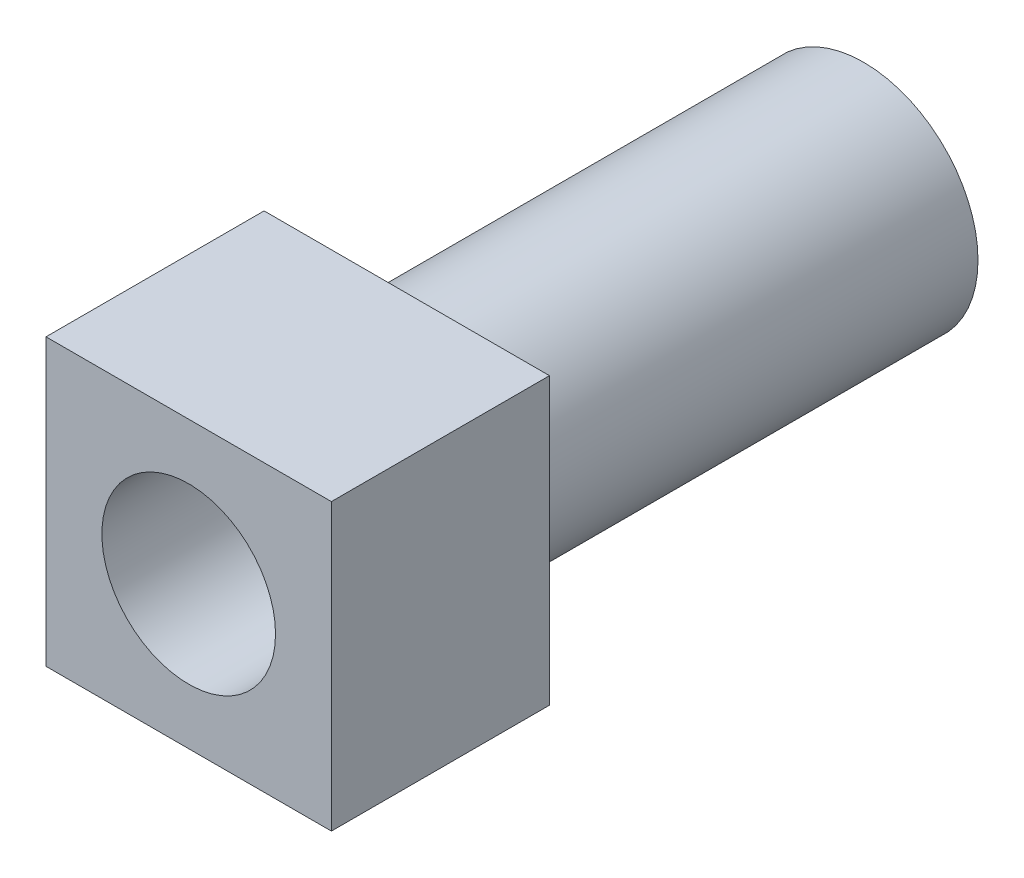
ISO-10303-21;
HEADER;
FILE_DESCRIPTION(('STEP AP214'),'2;1');
FILE_NAME('part.step','',(''),(''),'','','');
FILE_SCHEMA(('AUTOMOTIVE_DESIGN { 1 0 10303 214 1 1 1 1 }'));
ENDSEC;
DATA;
#1=APPLICATION_CONTEXT('core data for automotive mechanical design processes');
#2=APPLICATION_PROTOCOL_DEFINITION('international standard','automotive_design',2000,#1);
#3=PRODUCT_CONTEXT('',#1,'mechanical');
#4=PRODUCT('Part','Part','',(#3));
#5=PRODUCT_RELATED_PRODUCT_CATEGORY('part','',(#4));
#6=PRODUCT_DEFINITION_FORMATION('','',#4);
#7=PRODUCT_DEFINITION_CONTEXT('part definition',#1,'design');
#8=PRODUCT_DEFINITION('design','',#6,#7);
#9=PRODUCT_DEFINITION_SHAPE('','',#8);
#10=(LENGTH_UNIT() NAMED_UNIT(*) SI_UNIT(.MILLI.,.METRE.));
#11=(NAMED_UNIT(*) PLANE_ANGLE_UNIT() SI_UNIT($,.RADIAN.));
#12=(NAMED_UNIT(*) SI_UNIT($,.STERADIAN.) SOLID_ANGLE_UNIT());
#13=UNCERTAINTY_MEASURE_WITH_UNIT(LENGTH_MEASURE(1.E-05),#10,'distance_accuracy_value','');
#14=(GEOMETRIC_REPRESENTATION_CONTEXT(3) GLOBAL_UNCERTAINTY_ASSIGNED_CONTEXT((#13)) GLOBAL_UNIT_ASSIGNED_CONTEXT((#10,
#11,#12)) REPRESENTATION_CONTEXT('',''));
#15=CARTESIAN_POINT('',(0.,0.,0.));
#16=DIRECTION('',(0.,0.,1.));
#17=DIRECTION('',(1.,0.,0.));
#18=AXIS2_PLACEMENT_3D('',#15,#16,#17);
#19=CARTESIAN_POINT('',(0.,0.,0.));
#20=DIRECTION('',(0.,0.,1.));
#21=DIRECTION('',(1.,0.,0.));
#22=AXIS2_PLACEMENT_3D('',#19,#20,#21);
#23=PLANE('',#22);
#24=DIRECTION('',(0.,-1.,0.));
#25=VECTOR('',#24,1.);
#26=CARTESIAN_POINT('',(-37.0560711306256,15.4804,0.));
#27=LINE('',#26,#25);
#28=CARTESIAN_POINT('',(-37.0560711306256,15.4804,0.));
#29=VERTEX_POINT('',#28);
#30=CARTESIAN_POINT('',(-37.0560711306256,1.74039999999999,0.));
#31=VERTEX_POINT('',#30);
#32=EDGE_CURVE('E125',#29,#31,#27,.T.);
#33=ORIENTED_EDGE('',*,*,#32,.F.);
#34=DIRECTION('',(-1.,0.,0.));
#35=VECTOR('',#34,1.);
#36=CARTESIAN_POINT('',(-37.0560711306256,15.4804,0.));
#37=LINE('',#36,#35);
#38=CARTESIAN_POINT('',(-23.3160711306256,15.4804,0.));
#39=VERTEX_POINT('',#38);
#40=EDGE_CURVE('E80',#39,#29,#37,.T.);
#41=ORIENTED_EDGE('',*,*,#40,.F.);
#42=DIRECTION('',(0.,1.,0.));
#43=VECTOR('',#42,1.);
#44=CARTESIAN_POINT('',(-23.3160711306256,15.4804,0.));
#45=LINE('',#44,#43);
#46=CARTESIAN_POINT('',(-23.3160711306256,1.74039999999999,0.));
#47=VERTEX_POINT('',#46);
#48=EDGE_CURVE('E139',#47,#39,#45,.T.);
#49=ORIENTED_EDGE('',*,*,#48,.F.);
#50=DIRECTION('',(1.,0.,0.));
#51=VECTOR('',#50,1.);
#52=CARTESIAN_POINT('',(-37.0560711306256,1.74039999999999,0.));
#53=LINE('',#52,#51);
#54=EDGE_CURVE('E137',#31,#47,#53,.T.);
#55=ORIENTED_EDGE('',*,*,#54,.F.);
#56=EDGE_LOOP('',(#33,#41,#49,#55));
#57=FACE_BOUND('',#56,.T.);
#58=CARTESIAN_POINT('',(-30.1860711306256,8.61039999999999,0.));
#59=DIRECTION('',(0.,0.,1.));
#60=DIRECTION('',(1.,0.,0.));
#61=AXIS2_PLACEMENT_3D('',#58,#59,#60);
#62=CIRCLE('',#61,5.5);
#63=CARTESIAN_POINT('',(-24.6860711306256,8.61039999999999,0.));
#64=VERTEX_POINT('',#63);
#65=EDGE_CURVE('E11',#64,#64,#62,.F.);
#66=ORIENTED_EDGE('',*,*,#65,.F.);
#67=EDGE_LOOP('',(#66));
#68=FACE_BOUND('',#67,.T.);
#69=ADVANCED_FACE('F35',(#57,#68),#23,.F.);
#70=CARTESIAN_POINT('',(-37.0560711306256,15.4804,10.5));
#71=DIRECTION('',(1.,0.,0.));
#72=DIRECTION('',(0.,0.,-1.));
#73=AXIS2_PLACEMENT_3D('',#70,#71,#72);
#74=PLANE('',#73);
#75=ORIENTED_EDGE('',*,*,#32,.T.);
#76=DIRECTION('',(0.,0.,-1.));
#77=VECTOR('',#76,1.);
#78=CARTESIAN_POINT('',(-37.0560711306256,1.74039999999999,10.5));
#79=LINE('',#78,#77);
#80=CARTESIAN_POINT('',(-37.0560711306256,1.74039999999999,10.5));
#81=VERTEX_POINT('',#80);
#82=EDGE_CURVE('E43',#81,#31,#79,.T.);
#83=ORIENTED_EDGE('',*,*,#82,.F.);
#84=DIRECTION('',(0.,-1.,0.));
#85=VECTOR('',#84,1.);
#86=CARTESIAN_POINT('',(-37.0560711306256,15.4804,10.5));
#87=LINE('',#86,#85);
#88=CARTESIAN_POINT('',(-37.0560711306256,15.4804,10.5));
#89=VERTEX_POINT('',#88);
#90=EDGE_CURVE('E128',#89,#81,#87,.T.);
#91=ORIENTED_EDGE('',*,*,#90,.F.);
#92=DIRECTION('',(0.,0.,-1.));
#93=VECTOR('',#92,1.);
#94=CARTESIAN_POINT('',(-37.0560711306256,15.4804,10.5));
#95=LINE('',#94,#93);
#96=EDGE_CURVE('E134',#89,#29,#95,.T.);
#97=ORIENTED_EDGE('',*,*,#96,.T.);
#98=EDGE_LOOP('',(#75,#83,#91,#97));
#99=FACE_BOUND('',#98,.T.);
#100=ADVANCED_FACE('F37',(#99),#74,.F.);
#101=CARTESIAN_POINT('',(-37.0560711306256,1.74039999999999,10.5));
#102=DIRECTION('',(0.,1.,0.));
#103=DIRECTION('',(0.,0.,1.));
#104=AXIS2_PLACEMENT_3D('',#101,#102,#103);
#105=PLANE('',#104);
#106=ORIENTED_EDGE('',*,*,#54,.T.);
#107=DIRECTION('',(0.,0.,-1.));
#108=VECTOR('',#107,1.);
#109=CARTESIAN_POINT('',(-23.3160711306256,1.74039999999999,10.5));
#110=LINE('',#109,#108);
#111=CARTESIAN_POINT('',(-23.3160711306256,1.74039999999999,10.5));
#112=VERTEX_POINT('',#111);
#113=EDGE_CURVE('E145',#112,#47,#110,.T.);
#114=ORIENTED_EDGE('',*,*,#113,.F.);
#115=DIRECTION('',(1.,0.,0.));
#116=VECTOR('',#115,1.);
#117=CARTESIAN_POINT('',(-37.0560711306256,1.74039999999999,10.5));
#118=LINE('',#117,#116);
#119=EDGE_CURVE('E88',#81,#112,#118,.T.);
#120=ORIENTED_EDGE('',*,*,#119,.F.);
#121=ORIENTED_EDGE('',*,*,#82,.T.);
#122=EDGE_LOOP('',(#106,#114,#120,#121));
#123=FACE_BOUND('',#122,.T.);
#124=ADVANCED_FACE('F148',(#123),#105,.F.);
#125=CARTESIAN_POINT('',(-23.3160711306256,15.4804,10.5));
#126=DIRECTION('',(-1.,0.,0.));
#127=DIRECTION('',(0.,-1.,0.));
#128=AXIS2_PLACEMENT_3D('',#125,#126,#127);
#129=PLANE('',#128);
#130=ORIENTED_EDGE('',*,*,#48,.T.);
#131=DIRECTION('',(0.,0.,-1.));
#132=VECTOR('',#131,1.);
#133=CARTESIAN_POINT('',(-23.3160711306256,15.4804,10.5));
#134=LINE('',#133,#132);
#135=CARTESIAN_POINT('',(-23.3160711306256,15.4804,10.5));
#136=VERTEX_POINT('',#135);
#137=EDGE_CURVE('E143',#136,#39,#134,.T.);
#138=ORIENTED_EDGE('',*,*,#137,.F.);
#139=DIRECTION('',(0.,1.,0.));
#140=VECTOR('',#139,1.);
#141=CARTESIAN_POINT('',(-23.3160711306256,15.4804,10.5));
#142=LINE('',#141,#140);
#143=EDGE_CURVE('E131',#112,#136,#142,.T.);
#144=ORIENTED_EDGE('',*,*,#143,.F.);
#145=ORIENTED_EDGE('',*,*,#113,.T.);
#146=EDGE_LOOP('',(#130,#138,#144,#145));
#147=FACE_BOUND('',#146,.T.);
#148=ADVANCED_FACE('F157',(#147),#129,.F.);
#149=CARTESIAN_POINT('',(-37.0560711306256,15.4804,10.5));
#150=DIRECTION('',(0.,-1.,0.));
#151=DIRECTION('',(0.,0.,-1.));
#152=AXIS2_PLACEMENT_3D('',#149,#150,#151);
#153=PLANE('',#152);
#154=ORIENTED_EDGE('',*,*,#40,.T.);
#155=ORIENTED_EDGE('',*,*,#96,.F.);
#156=DIRECTION('',(-1.,0.,0.));
#157=VECTOR('',#156,1.);
#158=CARTESIAN_POINT('',(-37.0560711306256,15.4804,10.5));
#159=LINE('',#158,#157);
#160=EDGE_CURVE('E59',#136,#89,#159,.T.);
#161=ORIENTED_EDGE('',*,*,#160,.F.);
#162=ORIENTED_EDGE('',*,*,#137,.T.);
#163=EDGE_LOOP('',(#154,#155,#161,#162));
#164=FACE_BOUND('',#163,.T.);
#165=ADVANCED_FACE('F159',(#164),#153,.F.);
#166=CARTESIAN_POINT('',(0.,0.,10.5));
#167=DIRECTION('',(0.,0.,1.));
#168=DIRECTION('',(1.,0.,0.));
#169=AXIS2_PLACEMENT_3D('',#166,#167,#168);
#170=PLANE('',#169);
#171=CARTESIAN_POINT('',(-30.1860711306256,8.61039999999999,10.5));
#172=DIRECTION('',(0.,0.,1.));
#173=DIRECTION('',(1.,0.,0.));
#174=AXIS2_PLACEMENT_3D('',#171,#172,#173);
#175=CIRCLE('',#174,4.18);
#176=CARTESIAN_POINT('',(-26.0060711306256,8.61039999999999,10.5));
#177=VERTEX_POINT('',#176);
#178=EDGE_CURVE('E120',#177,#177,#175,.T.);
#179=ORIENTED_EDGE('',*,*,#178,.F.);
#180=EDGE_LOOP('',(#179));
#181=FACE_BOUND('',#180,.T.);
#182=ORIENTED_EDGE('',*,*,#90,.T.);
#183=ORIENTED_EDGE('',*,*,#119,.T.);
#184=ORIENTED_EDGE('',*,*,#143,.T.);
#185=ORIENTED_EDGE('',*,*,#160,.T.);
#186=EDGE_LOOP('',(#182,#183,#184,#185));
#187=FACE_BOUND('',#186,.T.);
#188=ADVANCED_FACE('F160',(#181,#187),#170,.T.);
#189=CARTESIAN_POINT('',(-30.1860711306256,8.61039999999999,0.5));
#190=DIRECTION('',(0.,0.,1.));
#191=DIRECTION('',(1.,0.,0.));
#192=AXIS2_PLACEMENT_3D('',#189,#190,#191);
#193=CYLINDRICAL_SURFACE('',#192,4.18);
#194=CARTESIAN_POINT('',(-30.1860711306256,8.61039999999999,0.5));
#195=DIRECTION('',(0.,0.,1.));
#196=DIRECTION('',(1.,0.,0.));
#197=AXIS2_PLACEMENT_3D('',#194,#195,#196);
#198=CIRCLE('',#197,4.18);
#199=CARTESIAN_POINT('',(-26.0060711306256,8.61039999999999,0.5));
#200=VERTEX_POINT('',#199);
#201=EDGE_CURVE('E122',#200,#200,#198,.T.);
#202=ORIENTED_EDGE('',*,*,#201,.F.);
#203=EDGE_LOOP('',(#202));
#204=FACE_BOUND('',#203,.T.);
#205=ORIENTED_EDGE('',*,*,#178,.T.);
#206=EDGE_LOOP('',(#205));
#207=FACE_BOUND('',#206,.T.);
#208=ADVANCED_FACE('F162',(#204,#207),#193,.F.);
#209=CARTESIAN_POINT('',(-30.1860711306256,8.61039999999999,0.5));
#210=DIRECTION('',(0.,0.,1.));
#211=DIRECTION('',(1.,0.,0.));
#212=AXIS2_PLACEMENT_3D('',#209,#210,#211);
#213=PLANE('',#212);
#214=ORIENTED_EDGE('',*,*,#201,.T.);
#215=EDGE_LOOP('',(#214));
#216=FACE_BOUND('',#215,.T.);
#217=ADVANCED_FACE('F169',(#216),#213,.T.);
#218=CARTESIAN_POINT('',(-30.1860711306256,8.61039999999999,-22.));
#219=DIRECTION('',(0.,0.,1.));
#220=DIRECTION('',(1.,0.,0.));
#221=AXIS2_PLACEMENT_3D('',#218,#219,#220);
#222=CYLINDRICAL_SURFACE('',#221,5.5);
#223=CARTESIAN_POINT('',(-30.1860711306256,8.61039999999999,-22.));
#224=DIRECTION('',(0.,0.,-1.));
#225=DIRECTION('',(-1.,0.,0.));
#226=AXIS2_PLACEMENT_3D('',#223,#224,#225);
#227=CIRCLE('',#226,5.5);
#228=CARTESIAN_POINT('',(-35.6860711306256,8.61039999999999,-22.));
#229=VERTEX_POINT('',#228);
#230=EDGE_CURVE('E112',#229,#229,#227,.T.);
#231=ORIENTED_EDGE('',*,*,#230,.F.);
#232=EDGE_LOOP('',(#231));
#233=FACE_BOUND('',#232,.T.);
#234=ORIENTED_EDGE('',*,*,#65,.T.);
#235=EDGE_LOOP('',(#234));
#236=FACE_BOUND('',#235,.T.);
#237=ADVANCED_FACE('F192',(#233,#236),#222,.T.);
#238=CARTESIAN_POINT('',(-30.1860711306256,8.61039999999999,-22.));
#239=DIRECTION('',(0.,0.,1.));
#240=DIRECTION('',(1.,0.,0.));
#241=AXIS2_PLACEMENT_3D('',#238,#239,#240);
#242=CYLINDRICAL_SURFACE('',#241,2.49);
#243=CARTESIAN_POINT('',(-30.1860711306256,8.61039999999999,0.));
#244=DIRECTION('',(0.,0.,-1.));
#245=DIRECTION('',(-1.,0.,0.));
#246=AXIS2_PLACEMENT_3D('',#243,#244,#245);
#247=CIRCLE('',#246,2.49);
#248=CARTESIAN_POINT('',(-27.6960711306256,8.61039999999999,0.));
#249=VERTEX_POINT('',#248);
#250=CARTESIAN_POINT('',(-29.6257900061276,11.0365461335895,0.));
#251=VERTEX_POINT('',#250);
#252=EDGE_CURVE('E99',#249,#251,#247,.T.);
#253=ORIENTED_EDGE('',*,*,#252,.F.);
#254=DIRECTION('',(0.,0.,-1.));
#255=VECTOR('',#254,1.);
#256=CARTESIAN_POINT('',(-27.6960711306256,8.61039999999999,0.));
#257=LINE('',#256,#255);
#258=CARTESIAN_POINT('',(-27.6960711306256,8.61039999999999,-22.));
#259=VERTEX_POINT('',#258);
#260=EDGE_CURVE('E96',#249,#259,#257,.T.);
#261=ORIENTED_EDGE('',*,*,#260,.T.);
#262=CARTESIAN_POINT('',(-30.1860711306256,8.61039999999999,-22.));
#263=DIRECTION('',(0.,0.,-1.));
#264=DIRECTION('',(-1.,0.,0.));
#265=AXIS2_PLACEMENT_3D('',#262,#263,#264);
#266=CIRCLE('',#265,2.49);
#267=CARTESIAN_POINT('',(-29.6257900061276,11.0365461335895,-22.));
#268=VERTEX_POINT('',#267);
#269=EDGE_CURVE('E50',#259,#268,#266,.T.);
#270=ORIENTED_EDGE('',*,*,#269,.T.);
#271=DIRECTION('',(0.,0.,-1.));
#272=VECTOR('',#271,1.);
#273=CARTESIAN_POINT('',(-29.6257900061276,11.0365461335895,0.));
#274=LINE('',#273,#272);
#275=EDGE_CURVE('E104',#251,#268,#274,.T.);
#276=ORIENTED_EDGE('',*,*,#275,.F.);
#277=EDGE_LOOP('',(#253,#261,#270,#276));
#278=FACE_BOUND('',#277,.T.);
#279=ADVANCED_FACE('F97',(#278),#242,.F.);
#280=CARTESIAN_POINT('',(-12.7692197437434,-10.1564386513182,0.));
#281=DIRECTION('',(-0.78262778502887,-0.622489959839357,0.));
#282=DIRECTION('',(0.622489959839357,-0.78262778502887,0.));
#283=AXIS2_PLACEMENT_3D('',#280,#281,#282);
#284=PLANE('',#283);
#285=DIRECTION('',(-0.622489959839357,0.78262778502887,0.));
#286=VECTOR('',#285,1.);
#287=CARTESIAN_POINT('',(-12.7692197437434,-10.1564386513182,-22.));
#288=LINE('',#287,#286);
#289=EDGE_CURVE('E111',#259,#268,#288,.T.);
#290=ORIENTED_EDGE('',*,*,#289,.F.);
#291=ORIENTED_EDGE('',*,*,#260,.F.);
#292=DIRECTION('',(-0.622489959839357,0.78262778502887,0.));
#293=VECTOR('',#292,1.);
#294=CARTESIAN_POINT('',(-12.7692197437434,-10.1564386513182,0.));
#295=LINE('',#294,#293);
#296=EDGE_CURVE('E105',#249,#251,#295,.T.);
#297=ORIENTED_EDGE('',*,*,#296,.T.);
#298=ORIENTED_EDGE('',*,*,#275,.T.);
#299=EDGE_LOOP('',(#290,#291,#297,#298));
#300=FACE_BOUND('',#299,.T.);
#301=ADVANCED_FACE('F114',(#300),#284,.T.);
#302=ORIENTED_EDGE('',*,*,#296,.F.);
#303=ORIENTED_EDGE('',*,*,#252,.T.);
#304=EDGE_LOOP('',(#302,#303));
#305=FACE_BOUND('',#304,.T.);
#306=ADVANCED_FACE('F176',(#305),#23,.F.);
#307=CARTESIAN_POINT('',(-30.1860711306256,8.61039999999999,-22.));
#308=DIRECTION('',(0.,0.,-1.));
#309=DIRECTION('',(-1.,0.,0.));
#310=AXIS2_PLACEMENT_3D('',#307,#308,#309);
#311=PLANE('',#310);
#312=ORIENTED_EDGE('',*,*,#289,.T.);
#313=ORIENTED_EDGE('',*,*,#269,.F.);
#314=EDGE_LOOP('',(#312,#313));
#315=FACE_BOUND('',#314,.T.);
#316=ORIENTED_EDGE('',*,*,#230,.T.);
#317=EDGE_LOOP('',(#316));
#318=FACE_BOUND('',#317,.T.);
#319=ADVANCED_FACE('F109',(#315,#318),#311,.T.);
#320=CLOSED_SHELL('',(#69,#100,#124,#148,#165,#188,#208,#217,#237,#279,#301,#306,#319));
#321=MANIFOLD_SOLID_BREP('B2',#320);
#322=ADVANCED_BREP_SHAPE_REPRESENTATION('',(#18,#321),#14);
#323=SHAPE_DEFINITION_REPRESENTATION(#9,#322);
ENDSEC;
END-ISO-10303-21;
